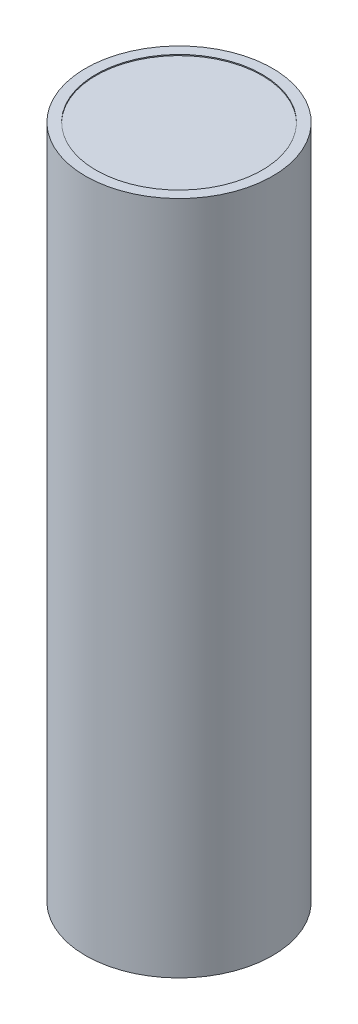
ISO-10303-21;
HEADER;
FILE_DESCRIPTION(('STEP AP214'),'2;1');
FILE_NAME('part.step','',(''),(''),'','','');
FILE_SCHEMA(('AUTOMOTIVE_DESIGN { 1 0 10303 214 1 1 1 1 }'));
ENDSEC;
DATA;
#1=APPLICATION_CONTEXT('core data for automotive mechanical design processes');
#2=APPLICATION_PROTOCOL_DEFINITION('international standard','automotive_design',2000,#1);
#3=PRODUCT_CONTEXT('',#1,'mechanical');
#4=PRODUCT('Part','Part','',(#3));
#5=PRODUCT_RELATED_PRODUCT_CATEGORY('part','',(#4));
#6=PRODUCT_DEFINITION_FORMATION('','',#4);
#7=PRODUCT_DEFINITION_CONTEXT('part definition',#1,'design');
#8=PRODUCT_DEFINITION('design','',#6,#7);
#9=PRODUCT_DEFINITION_SHAPE('','',#8);
#10=(LENGTH_UNIT() NAMED_UNIT(*) SI_UNIT(.MILLI.,.METRE.));
#11=(NAMED_UNIT(*) PLANE_ANGLE_UNIT() SI_UNIT($,.RADIAN.));
#12=(NAMED_UNIT(*) SI_UNIT($,.STERADIAN.) SOLID_ANGLE_UNIT());
#13=UNCERTAINTY_MEASURE_WITH_UNIT(LENGTH_MEASURE(1.E-05),#10,'distance_accuracy_value','');
#14=(GEOMETRIC_REPRESENTATION_CONTEXT(3) GLOBAL_UNCERTAINTY_ASSIGNED_CONTEXT((#13)) GLOBAL_UNIT_ASSIGNED_CONTEXT((#10,
#11,#12)) REPRESENTATION_CONTEXT('',''));
#15=CARTESIAN_POINT('',(0.,0.,0.));
#16=DIRECTION('',(0.,0.,1.));
#17=DIRECTION('',(1.,0.,0.));
#18=AXIS2_PLACEMENT_3D('',#15,#16,#17);
#19=CARTESIAN_POINT('',(0.,65.,0.));
#20=DIRECTION('',(0.,-1.,0.));
#21=DIRECTION('',(0.,0.,-1.));
#22=AXIS2_PLACEMENT_3D('',#19,#20,#21);
#23=CYLINDRICAL_SURFACE('',#22,9.);
#24=CARTESIAN_POINT('',(0.,65.,0.));
#25=DIRECTION('',(0.,1.,0.));
#26=DIRECTION('',(0.,0.,1.));
#27=AXIS2_PLACEMENT_3D('',#24,#25,#26);
#28=CIRCLE('',#27,9.);
#29=CARTESIAN_POINT('',(0.,65.,9.));
#30=VERTEX_POINT('',#29);
#31=EDGE_CURVE('E10',#30,#30,#28,.T.);
#32=ORIENTED_EDGE('',*,*,#31,.F.);
#33=EDGE_LOOP('',(#32));
#34=FACE_BOUND('',#33,.T.);
#35=CARTESIAN_POINT('',(0.,0.,0.));
#36=DIRECTION('',(0.,1.,0.));
#37=DIRECTION('',(0.,0.,1.));
#38=AXIS2_PLACEMENT_3D('',#35,#36,#37);
#39=CIRCLE('',#38,9.);
#40=CARTESIAN_POINT('',(0.,0.,9.));
#41=VERTEX_POINT('',#40);
#42=EDGE_CURVE('E48',#41,#41,#39,.T.);
#43=ORIENTED_EDGE('',*,*,#42,.T.);
#44=EDGE_LOOP('',(#43));
#45=FACE_BOUND('',#44,.T.);
#46=ADVANCED_FACE('F45',(#34,#45),#23,.T.);
#47=CARTESIAN_POINT('',(0.,65.,0.));
#48=DIRECTION('',(0.,1.,0.));
#49=DIRECTION('',(0.,0.,1.));
#50=AXIS2_PLACEMENT_3D('',#47,#48,#49);
#51=PLANE('',#50);
#52=CARTESIAN_POINT('',(0.,65.,0.));
#53=DIRECTION('',(0.,1.,0.));
#54=DIRECTION('',(0.,0.,1.));
#55=AXIS2_PLACEMENT_3D('',#52,#53,#54);
#56=CIRCLE('',#55,8.);
#57=CARTESIAN_POINT('',(0.,65.,8.));
#58=VERTEX_POINT('',#57);
#59=EDGE_CURVE('E57',#58,#58,#56,.T.);
#60=ORIENTED_EDGE('',*,*,#59,.F.);
#61=EDGE_LOOP('',(#60));
#62=FACE_BOUND('',#61,.T.);
#63=ORIENTED_EDGE('',*,*,#31,.T.);
#64=EDGE_LOOP('',(#63));
#65=FACE_BOUND('',#64,.T.);
#66=ADVANCED_FACE('F81',(#62,#65),#51,.T.);
#67=CARTESIAN_POINT('',(0.,0.,0.));
#68=DIRECTION('',(0.,1.,0.));
#69=DIRECTION('',(0.,0.,1.));
#70=AXIS2_PLACEMENT_3D('',#67,#68,#69);
#71=PLANE('',#70);
#72=CARTESIAN_POINT('',(0.,0.,0.));
#73=DIRECTION('',(0.,1.,0.));
#74=DIRECTION('',(0.,0.,1.));
#75=AXIS2_PLACEMENT_3D('',#72,#73,#74);
#76=CIRCLE('',#75,8.);
#77=CARTESIAN_POINT('',(0.,0.,8.));
#78=VERTEX_POINT('',#77);
#79=EDGE_CURVE('E63',#78,#78,#76,.T.);
#80=ORIENTED_EDGE('',*,*,#79,.T.);
#81=EDGE_LOOP('',(#80));
#82=FACE_BOUND('',#81,.T.);
#83=ORIENTED_EDGE('',*,*,#42,.F.);
#84=EDGE_LOOP('',(#83));
#85=FACE_BOUND('',#84,.T.);
#86=ADVANCED_FACE('F86',(#82,#85),#71,.F.);
#87=CARTESIAN_POINT('',(0.,64.9,0.));
#88=DIRECTION('',(0.,1.,0.));
#89=DIRECTION('',(0.,0.,1.));
#90=AXIS2_PLACEMENT_3D('',#87,#88,#89);
#91=CYLINDRICAL_SURFACE('',#90,8.);
#92=CARTESIAN_POINT('',(0.,64.9,0.));
#93=DIRECTION('',(0.,1.,0.));
#94=DIRECTION('',(0.,0.,1.));
#95=AXIS2_PLACEMENT_3D('',#92,#93,#94);
#96=CIRCLE('',#95,8.);
#97=CARTESIAN_POINT('',(0.,64.9,8.));
#98=VERTEX_POINT('',#97);
#99=EDGE_CURVE('E55',#98,#98,#96,.T.);
#100=ORIENTED_EDGE('',*,*,#99,.F.);
#101=EDGE_LOOP('',(#100));
#102=FACE_BOUND('',#101,.T.);
#103=ORIENTED_EDGE('',*,*,#59,.T.);
#104=EDGE_LOOP('',(#103));
#105=FACE_BOUND('',#104,.T.);
#106=ADVANCED_FACE('F93',(#102,#105),#91,.F.);
#107=CARTESIAN_POINT('',(0.,64.9,0.));
#108=DIRECTION('',(0.,1.,0.));
#109=DIRECTION('',(0.,0.,1.));
#110=AXIS2_PLACEMENT_3D('',#107,#108,#109);
#111=PLANE('',#110);
#112=ORIENTED_EDGE('',*,*,#99,.T.);
#113=EDGE_LOOP('',(#112));
#114=FACE_BOUND('',#113,.T.);
#115=ADVANCED_FACE('F78',(#114),#111,.T.);
#116=CARTESIAN_POINT('',(0.,0.1,0.));
#117=DIRECTION('',(0.,-1.,0.));
#118=DIRECTION('',(0.,0.,-1.));
#119=AXIS2_PLACEMENT_3D('',#116,#117,#118);
#120=CYLINDRICAL_SURFACE('',#119,8.);
#121=CARTESIAN_POINT('',(0.,0.1,0.));
#122=DIRECTION('',(0.,1.,0.));
#123=DIRECTION('',(0.,0.,1.));
#124=AXIS2_PLACEMENT_3D('',#121,#122,#123);
#125=CIRCLE('',#124,8.);
#126=CARTESIAN_POINT('',(0.,0.1,8.));
#127=VERTEX_POINT('',#126);
#128=EDGE_CURVE('E60',#127,#127,#125,.T.);
#129=ORIENTED_EDGE('',*,*,#128,.T.);
#130=EDGE_LOOP('',(#129));
#131=FACE_BOUND('',#130,.T.);
#132=ORIENTED_EDGE('',*,*,#79,.F.);
#133=EDGE_LOOP('',(#132));
#134=FACE_BOUND('',#133,.T.);
#135=ADVANCED_FACE('F69',(#131,#134),#120,.F.);
#136=CARTESIAN_POINT('',(0.,0.1,0.));
#137=DIRECTION('',(0.,-1.,0.));
#138=DIRECTION('',(0.,0.,1.));
#139=AXIS2_PLACEMENT_3D('',#136,#137,#138);
#140=PLANE('',#139);
#141=ORIENTED_EDGE('',*,*,#128,.F.);
#142=EDGE_LOOP('',(#141));
#143=FACE_BOUND('',#142,.T.);
#144=ADVANCED_FACE('F72',(#143),#140,.T.);
#145=CLOSED_SHELL('',(#46,#66,#86,#106,#115,#135,#144));
#146=MANIFOLD_SOLID_BREP('B2',#145);
#147=ADVANCED_BREP_SHAPE_REPRESENTATION('',(#18,#146),#14);
#148=SHAPE_DEFINITION_REPRESENTATION(#9,#147);
ENDSEC;
END-ISO-10303-21;
